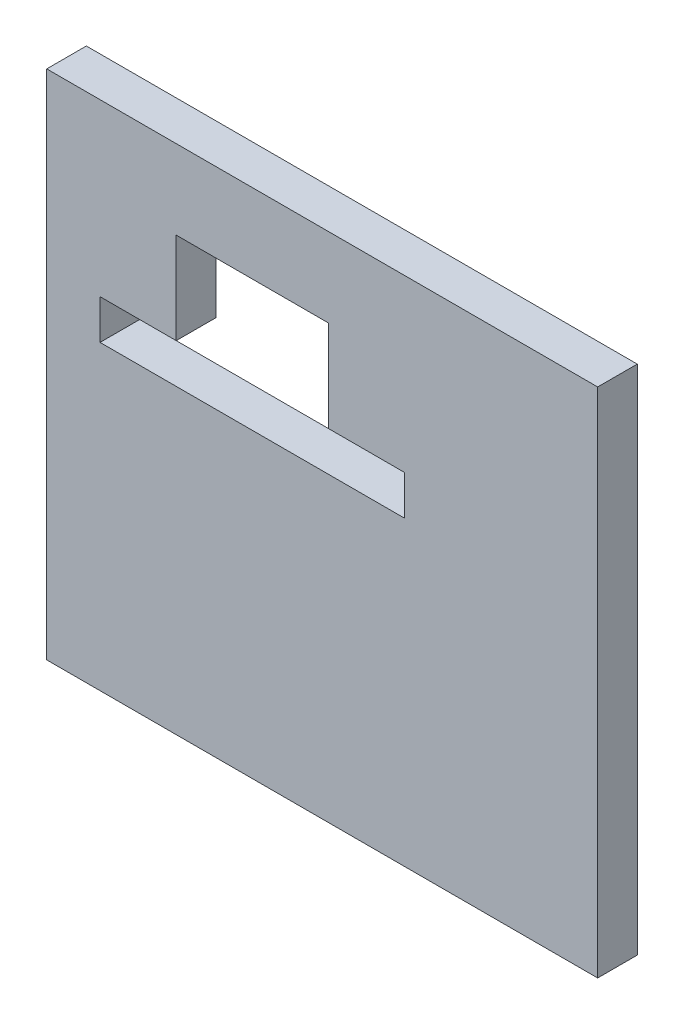
ISO-10303-21;
HEADER;
FILE_DESCRIPTION(('STEP AP214'),'2;1');
FILE_NAME('part.step','',(''),(''),'','','');
FILE_SCHEMA(('AUTOMOTIVE_DESIGN { 1 0 10303 214 1 1 1 1 }'));
ENDSEC;
DATA;
#1=APPLICATION_CONTEXT('core data for automotive mechanical design processes');
#2=APPLICATION_PROTOCOL_DEFINITION('international standard','automotive_design',2000,#1);
#3=PRODUCT_CONTEXT('',#1,'mechanical');
#4=PRODUCT('Part','Part','',(#3));
#5=PRODUCT_RELATED_PRODUCT_CATEGORY('part','',(#4));
#6=PRODUCT_DEFINITION_FORMATION('','',#4);
#7=PRODUCT_DEFINITION_CONTEXT('part definition',#1,'design');
#8=PRODUCT_DEFINITION('design','',#6,#7);
#9=PRODUCT_DEFINITION_SHAPE('','',#8);
#10=(LENGTH_UNIT() NAMED_UNIT(*) SI_UNIT(.MILLI.,.METRE.));
#11=(NAMED_UNIT(*) PLANE_ANGLE_UNIT() SI_UNIT($,.RADIAN.));
#12=(NAMED_UNIT(*) SI_UNIT($,.STERADIAN.) SOLID_ANGLE_UNIT());
#13=UNCERTAINTY_MEASURE_WITH_UNIT(LENGTH_MEASURE(1.E-05),#10,'distance_accuracy_value','');
#14=(GEOMETRIC_REPRESENTATION_CONTEXT(3) GLOBAL_UNCERTAINTY_ASSIGNED_CONTEXT((#13)) GLOBAL_UNIT_ASSIGNED_CONTEXT((#10,
#11,#12)) REPRESENTATION_CONTEXT('',''));
#15=CARTESIAN_POINT('',(0.,0.,0.));
#16=DIRECTION('',(0.,0.,1.));
#17=DIRECTION('',(1.,0.,0.));
#18=AXIS2_PLACEMENT_3D('',#15,#16,#17);
#19=CARTESIAN_POINT('',(37.,0.,5.2));
#20=DIRECTION('',(1.,0.,0.));
#21=DIRECTION('',(0.,0.,-1.));
#22=AXIS2_PLACEMENT_3D('',#19,#20,#21);
#23=PLANE('',#22);
#24=DIRECTION('',(0.,-1.,0.));
#25=VECTOR('',#24,1.);
#26=CARTESIAN_POINT('',(37.,0.,0.));
#27=LINE('',#26,#25);
#28=CARTESIAN_POINT('',(37.,56.8,0.));
#29=VERTEX_POINT('',#28);
#30=CARTESIAN_POINT('',(37.,44.8,0.));
#31=VERTEX_POINT('',#30);
#32=EDGE_CURVE('E171',#29,#31,#27,.T.);
#33=ORIENTED_EDGE('',*,*,#32,.T.);
#34=DIRECTION('',(0.,0.,-1.));
#35=VECTOR('',#34,1.);
#36=CARTESIAN_POINT('',(37.,44.8,5.2));
#37=LINE('',#36,#35);
#38=CARTESIAN_POINT('',(37.,44.8,5.2));
#39=VERTEX_POINT('',#38);
#40=EDGE_CURVE('E11',#39,#31,#37,.T.);
#41=ORIENTED_EDGE('',*,*,#40,.F.);
#42=DIRECTION('',(0.,-1.,0.));
#43=VECTOR('',#42,1.);
#44=CARTESIAN_POINT('',(37.,0.,5.2));
#45=LINE('',#44,#43);
#46=CARTESIAN_POINT('',(37.,56.8,5.2));
#47=VERTEX_POINT('',#46);
#48=EDGE_CURVE('E270',#47,#39,#45,.T.);
#49=ORIENTED_EDGE('',*,*,#48,.F.);
#50=DIRECTION('',(0.,0.,-1.));
#51=VECTOR('',#50,1.);
#52=CARTESIAN_POINT('',(37.,56.8,5.2));
#53=LINE('',#52,#51);
#54=EDGE_CURVE('E190',#47,#29,#53,.T.);
#55=ORIENTED_EDGE('',*,*,#54,.T.);
#56=EDGE_LOOP('',(#33,#41,#49,#55));
#57=FACE_BOUND('',#56,.T.);
#58=ADVANCED_FACE('F35',(#57),#23,.F.);
#59=CARTESIAN_POINT('',(0.,44.8,5.2));
#60=DIRECTION('',(0.,1.,0.));
#61=DIRECTION('',(-1.,0.,0.));
#62=AXIS2_PLACEMENT_3D('',#59,#60,#61);
#63=PLANE('',#62);
#64=DIRECTION('',(1.,0.,0.));
#65=VECTOR('',#64,1.);
#66=CARTESIAN_POINT('',(0.,44.8,0.));
#67=LINE('',#66,#65);
#68=CARTESIAN_POINT('',(47.,44.8,0.));
#69=VERTEX_POINT('',#68);
#70=EDGE_CURVE('E174',#31,#69,#67,.T.);
#71=ORIENTED_EDGE('',*,*,#70,.T.);
#72=DIRECTION('',(0.,0.,-1.));
#73=VECTOR('',#72,1.);
#74=CARTESIAN_POINT('',(47.,44.8,5.2));
#75=LINE('',#74,#73);
#76=CARTESIAN_POINT('',(47.,44.8,5.2));
#77=VERTEX_POINT('',#76);
#78=EDGE_CURVE('E45',#77,#69,#75,.T.);
#79=ORIENTED_EDGE('',*,*,#78,.F.);
#80=DIRECTION('',(1.,0.,0.));
#81=VECTOR('',#80,1.);
#82=CARTESIAN_POINT('',(0.,44.8,5.2));
#83=LINE('',#82,#81);
#84=EDGE_CURVE('E272',#39,#77,#83,.T.);
#85=ORIENTED_EDGE('',*,*,#84,.F.);
#86=ORIENTED_EDGE('',*,*,#40,.T.);
#87=EDGE_LOOP('',(#71,#79,#85,#86));
#88=FACE_BOUND('',#87,.T.);
#89=ADVANCED_FACE('F231',(#88),#63,.F.);
#90=CARTESIAN_POINT('',(47.,0.,5.2));
#91=DIRECTION('',(-1.,0.,0.));
#92=DIRECTION('',(0.,0.,1.));
#93=AXIS2_PLACEMENT_3D('',#90,#91,#92);
#94=PLANE('',#93);
#95=DIRECTION('',(0.,1.,0.));
#96=VECTOR('',#95,1.);
#97=CARTESIAN_POINT('',(47.,0.,0.));
#98=LINE('',#97,#96);
#99=CARTESIAN_POINT('',(47.,39.6,0.));
#100=VERTEX_POINT('',#99);
#101=EDGE_CURVE('E177',#100,#69,#98,.T.);
#102=ORIENTED_EDGE('',*,*,#101,.F.);
#103=DIRECTION('',(0.,0.,-1.));
#104=VECTOR('',#103,1.);
#105=CARTESIAN_POINT('',(47.,39.6,5.2));
#106=LINE('',#105,#104);
#107=CARTESIAN_POINT('',(47.,39.6,5.2));
#108=VERTEX_POINT('',#107);
#109=EDGE_CURVE('E196',#108,#100,#106,.T.);
#110=ORIENTED_EDGE('',*,*,#109,.F.);
#111=DIRECTION('',(0.,1.,0.));
#112=VECTOR('',#111,1.);
#113=CARTESIAN_POINT('',(47.,0.,5.2));
#114=LINE('',#113,#112);
#115=EDGE_CURVE('E274',#108,#77,#114,.T.);
#116=ORIENTED_EDGE('',*,*,#115,.T.);
#117=ORIENTED_EDGE('',*,*,#78,.T.);
#118=EDGE_LOOP('',(#102,#110,#116,#117));
#119=FACE_BOUND('',#118,.T.);
#120=ADVANCED_FACE('F237',(#119),#94,.T.);
#121=CARTESIAN_POINT('',(0.,39.6,5.2));
#122=DIRECTION('',(0.,1.,0.));
#123=DIRECTION('',(0.,0.,1.));
#124=AXIS2_PLACEMENT_3D('',#121,#122,#123);
#125=PLANE('',#124);
#126=DIRECTION('',(1.,0.,0.));
#127=VECTOR('',#126,1.);
#128=CARTESIAN_POINT('',(0.,39.6,0.));
#129=LINE('',#128,#127);
#130=CARTESIAN_POINT('',(7.,39.6,0.));
#131=VERTEX_POINT('',#130);
#132=EDGE_CURVE('E180',#131,#100,#129,.T.);
#133=ORIENTED_EDGE('',*,*,#132,.F.);
#134=DIRECTION('',(0.,0.,-1.));
#135=VECTOR('',#134,1.);
#136=CARTESIAN_POINT('',(7.,39.6,5.2));
#137=LINE('',#136,#135);
#138=CARTESIAN_POINT('',(7.,39.6,5.2));
#139=VERTEX_POINT('',#138);
#140=EDGE_CURVE('E194',#139,#131,#137,.T.);
#141=ORIENTED_EDGE('',*,*,#140,.F.);
#142=DIRECTION('',(1.,0.,0.));
#143=VECTOR('',#142,1.);
#144=CARTESIAN_POINT('',(0.,39.6,5.2));
#145=LINE('',#144,#143);
#146=EDGE_CURVE('E277',#139,#108,#145,.T.);
#147=ORIENTED_EDGE('',*,*,#146,.T.);
#148=ORIENTED_EDGE('',*,*,#109,.T.);
#149=EDGE_LOOP('',(#133,#141,#147,#148));
#150=FACE_BOUND('',#149,.T.);
#151=ADVANCED_FACE('F243',(#150),#125,.T.);
#152=CARTESIAN_POINT('',(7.,0.,5.2));
#153=DIRECTION('',(1.,0.,0.));
#154=DIRECTION('',(0.,0.,-1.));
#155=AXIS2_PLACEMENT_3D('',#152,#153,#154);
#156=PLANE('',#155);
#157=DIRECTION('',(0.,-1.,0.));
#158=VECTOR('',#157,1.);
#159=CARTESIAN_POINT('',(7.,0.,0.));
#160=LINE('',#159,#158);
#161=CARTESIAN_POINT('',(7.,44.8,0.));
#162=VERTEX_POINT('',#161);
#163=EDGE_CURVE('E183',#162,#131,#160,.T.);
#164=ORIENTED_EDGE('',*,*,#163,.F.);
#165=DIRECTION('',(0.,0.,-1.));
#166=VECTOR('',#165,1.);
#167=CARTESIAN_POINT('',(7.,44.8,5.2));
#168=LINE('',#167,#166);
#169=CARTESIAN_POINT('',(7.,44.8,5.2));
#170=VERTEX_POINT('',#169);
#171=EDGE_CURVE('E151',#170,#162,#168,.T.);
#172=ORIENTED_EDGE('',*,*,#171,.F.);
#173=DIRECTION('',(0.,-1.,0.));
#174=VECTOR('',#173,1.);
#175=CARTESIAN_POINT('',(7.,0.,5.2));
#176=LINE('',#175,#174);
#177=EDGE_CURVE('E144',#170,#139,#176,.T.);
#178=ORIENTED_EDGE('',*,*,#177,.T.);
#179=ORIENTED_EDGE('',*,*,#140,.T.);
#180=EDGE_LOOP('',(#164,#172,#178,#179));
#181=FACE_BOUND('',#180,.T.);
#182=ADVANCED_FACE('F247',(#181),#156,.T.);
#183=CARTESIAN_POINT('',(0.,44.8,5.2));
#184=DIRECTION('',(0.,1.,0.));
#185=DIRECTION('',(-1.,0.,0.));
#186=AXIS2_PLACEMENT_3D('',#183,#184,#185);
#187=PLANE('',#186);
#188=DIRECTION('',(1.,0.,0.));
#189=VECTOR('',#188,1.);
#190=CARTESIAN_POINT('',(0.,44.8,0.));
#191=LINE('',#190,#189);
#192=CARTESIAN_POINT('',(17.,44.8,0.));
#193=VERTEX_POINT('',#192);
#194=EDGE_CURVE('E150',#162,#193,#191,.T.);
#195=ORIENTED_EDGE('',*,*,#194,.T.);
#196=DIRECTION('',(0.,0.,-1.));
#197=VECTOR('',#196,1.);
#198=CARTESIAN_POINT('',(17.,44.8,5.2));
#199=LINE('',#198,#197);
#200=CARTESIAN_POINT('',(17.,44.8,5.2));
#201=VERTEX_POINT('',#200);
#202=EDGE_CURVE('E147',#201,#193,#199,.T.);
#203=ORIENTED_EDGE('',*,*,#202,.F.);
#204=DIRECTION('',(1.,0.,0.));
#205=VECTOR('',#204,1.);
#206=CARTESIAN_POINT('',(0.,44.8,5.2));
#207=LINE('',#206,#205);
#208=EDGE_CURVE('E137',#170,#201,#207,.T.);
#209=ORIENTED_EDGE('',*,*,#208,.F.);
#210=ORIENTED_EDGE('',*,*,#171,.T.);
#211=EDGE_LOOP('',(#195,#203,#209,#210));
#212=FACE_BOUND('',#211,.T.);
#213=ADVANCED_FACE('F148',(#212),#187,.F.);
#214=CARTESIAN_POINT('',(17.,0.,5.2));
#215=DIRECTION('',(-1.,0.,0.));
#216=DIRECTION('',(0.,0.,1.));
#217=AXIS2_PLACEMENT_3D('',#214,#215,#216);
#218=PLANE('',#217);
#219=DIRECTION('',(0.,1.,0.));
#220=VECTOR('',#219,1.);
#221=CARTESIAN_POINT('',(17.,0.,0.));
#222=LINE('',#221,#220);
#223=CARTESIAN_POINT('',(17.,56.8,0.));
#224=VERTEX_POINT('',#223);
#225=EDGE_CURVE('E95',#193,#224,#222,.T.);
#226=ORIENTED_EDGE('',*,*,#225,.T.);
#227=DIRECTION('',(0.,0.,-1.));
#228=VECTOR('',#227,1.);
#229=CARTESIAN_POINT('',(17.,56.8,5.2));
#230=LINE('',#229,#228);
#231=CARTESIAN_POINT('',(17.,56.8,5.2));
#232=VERTEX_POINT('',#231);
#233=EDGE_CURVE('E152',#232,#224,#230,.T.);
#234=ORIENTED_EDGE('',*,*,#233,.F.);
#235=DIRECTION('',(0.,1.,0.));
#236=VECTOR('',#235,1.);
#237=CARTESIAN_POINT('',(17.,0.,5.2));
#238=LINE('',#237,#236);
#239=EDGE_CURVE('E141',#201,#232,#238,.T.);
#240=ORIENTED_EDGE('',*,*,#239,.F.);
#241=ORIENTED_EDGE('',*,*,#202,.T.);
#242=EDGE_LOOP('',(#226,#234,#240,#241));
#243=FACE_BOUND('',#242,.T.);
#244=ADVANCED_FACE('F154',(#243),#218,.F.);
#245=CARTESIAN_POINT('',(0.,0.,5.2));
#246=DIRECTION('',(1.,0.,0.));
#247=DIRECTION('',(0.,1.,0.));
#248=AXIS2_PLACEMENT_3D('',#245,#246,#247);
#249=PLANE('',#248);
#250=DIRECTION('',(0.,-1.,0.));
#251=VECTOR('',#250,1.);
#252=CARTESIAN_POINT('',(0.,0.,0.));
#253=LINE('',#252,#251);
#254=CARTESIAN_POINT('',(0.,67.2,0.));
#255=VERTEX_POINT('',#254);
#256=CARTESIAN_POINT('',(0.,0.,0.));
#257=VERTEX_POINT('',#256);
#258=EDGE_CURVE('E160',#255,#257,#253,.T.);
#259=ORIENTED_EDGE('',*,*,#258,.T.);
#260=DIRECTION('',(0.,0.,-1.));
#261=VECTOR('',#260,1.);
#262=CARTESIAN_POINT('',(0.,0.,5.2));
#263=LINE('',#262,#261);
#264=CARTESIAN_POINT('',(0.,0.,5.2));
#265=VERTEX_POINT('',#264);
#266=EDGE_CURVE('E39',#265,#257,#263,.T.);
#267=ORIENTED_EDGE('',*,*,#266,.F.);
#268=DIRECTION('',(0.,-1.,0.));
#269=VECTOR('',#268,1.);
#270=CARTESIAN_POINT('',(0.,0.,5.2));
#271=LINE('',#270,#269);
#272=CARTESIAN_POINT('',(0.,67.2,5.2));
#273=VERTEX_POINT('',#272);
#274=EDGE_CURVE('E189',#273,#265,#271,.T.);
#275=ORIENTED_EDGE('',*,*,#274,.F.);
#276=DIRECTION('',(0.,0.,-1.));
#277=VECTOR('',#276,1.);
#278=CARTESIAN_POINT('',(0.,67.2,5.2));
#279=LINE('',#278,#277);
#280=EDGE_CURVE('E156',#273,#255,#279,.T.);
#281=ORIENTED_EDGE('',*,*,#280,.T.);
#282=EDGE_LOOP('',(#259,#267,#275,#281));
#283=FACE_BOUND('',#282,.T.);
#284=ADVANCED_FACE('F37',(#283),#249,.F.);
#285=CARTESIAN_POINT('',(0.,0.,5.2));
#286=DIRECTION('',(0.,1.,0.));
#287=DIRECTION('',(0.,0.,1.));
#288=AXIS2_PLACEMENT_3D('',#285,#286,#287);
#289=PLANE('',#288);
#290=DIRECTION('',(1.,0.,0.));
#291=VECTOR('',#290,1.);
#292=CARTESIAN_POINT('',(0.,0.,0.));
#293=LINE('',#292,#291);
#294=CARTESIAN_POINT('',(72.33,0.,0.));
#295=VERTEX_POINT('',#294);
#296=EDGE_CURVE('E163',#257,#295,#293,.T.);
#297=ORIENTED_EDGE('',*,*,#296,.T.);
#298=DIRECTION('',(0.,0.,-1.));
#299=VECTOR('',#298,1.);
#300=CARTESIAN_POINT('',(72.33,0.,5.2));
#301=LINE('',#300,#299);
#302=CARTESIAN_POINT('',(72.33,0.,5.2));
#303=VERTEX_POINT('',#302);
#304=EDGE_CURVE('E201',#303,#295,#301,.T.);
#305=ORIENTED_EDGE('',*,*,#304,.F.);
#306=DIRECTION('',(1.,0.,0.));
#307=VECTOR('',#306,1.);
#308=CARTESIAN_POINT('',(0.,0.,5.2));
#309=LINE('',#308,#307);
#310=EDGE_CURVE('E110',#265,#303,#309,.T.);
#311=ORIENTED_EDGE('',*,*,#310,.F.);
#312=ORIENTED_EDGE('',*,*,#266,.T.);
#313=EDGE_LOOP('',(#297,#305,#311,#312));
#314=FACE_BOUND('',#313,.T.);
#315=ADVANCED_FACE('F207',(#314),#289,.F.);
#316=CARTESIAN_POINT('',(72.33,0.,5.2));
#317=DIRECTION('',(-1.,0.,0.));
#318=DIRECTION('',(0.,0.,1.));
#319=AXIS2_PLACEMENT_3D('',#316,#317,#318);
#320=PLANE('',#319);
#321=DIRECTION('',(0.,1.,0.));
#322=VECTOR('',#321,1.);
#323=CARTESIAN_POINT('',(72.33,0.,0.));
#324=LINE('',#323,#322);
#325=CARTESIAN_POINT('',(72.33,67.2,0.));
#326=VERTEX_POINT('',#325);
#327=EDGE_CURVE('E165',#295,#326,#324,.T.);
#328=ORIENTED_EDGE('',*,*,#327,.T.);
#329=DIRECTION('',(0.,0.,-1.));
#330=VECTOR('',#329,1.);
#331=CARTESIAN_POINT('',(72.33,67.2,5.2));
#332=LINE('',#331,#330);
#333=CARTESIAN_POINT('',(72.33,67.2,5.2));
#334=VERTEX_POINT('',#333);
#335=EDGE_CURVE('E200',#334,#326,#332,.T.);
#336=ORIENTED_EDGE('',*,*,#335,.F.);
#337=DIRECTION('',(0.,1.,0.));
#338=VECTOR('',#337,1.);
#339=CARTESIAN_POINT('',(72.33,0.,5.2));
#340=LINE('',#339,#338);
#341=EDGE_CURVE('E265',#303,#334,#340,.T.);
#342=ORIENTED_EDGE('',*,*,#341,.F.);
#343=ORIENTED_EDGE('',*,*,#304,.T.);
#344=EDGE_LOOP('',(#328,#336,#342,#343));
#345=FACE_BOUND('',#344,.T.);
#346=ADVANCED_FACE('F221',(#345),#320,.F.);
#347=CARTESIAN_POINT('',(0.,67.2,5.2));
#348=DIRECTION('',(0.,1.,0.));
#349=DIRECTION('',(0.,0.,1.));
#350=AXIS2_PLACEMENT_3D('',#347,#348,#349);
#351=PLANE('',#350);
#352=DIRECTION('',(1.,0.,0.));
#353=VECTOR('',#352,1.);
#354=CARTESIAN_POINT('',(0.,67.2,0.));
#355=LINE('',#354,#353);
#356=EDGE_CURVE('E168',#255,#326,#355,.T.);
#357=ORIENTED_EDGE('',*,*,#356,.F.);
#358=ORIENTED_EDGE('',*,*,#280,.F.);
#359=DIRECTION('',(1.,0.,0.));
#360=VECTOR('',#359,1.);
#361=CARTESIAN_POINT('',(0.,67.2,5.2));
#362=LINE('',#361,#360);
#363=EDGE_CURVE('E220',#273,#334,#362,.T.);
#364=ORIENTED_EDGE('',*,*,#363,.T.);
#365=ORIENTED_EDGE('',*,*,#335,.T.);
#366=EDGE_LOOP('',(#357,#358,#364,#365));
#367=FACE_BOUND('',#366,.T.);
#368=ADVANCED_FACE('F216',(#367),#351,.T.);
#369=CARTESIAN_POINT('',(0.,56.8,5.2));
#370=DIRECTION('',(0.,1.,0.));
#371=DIRECTION('',(0.,0.,1.));
#372=AXIS2_PLACEMENT_3D('',#369,#370,#371);
#373=PLANE('',#372);
#374=DIRECTION('',(1.,0.,0.));
#375=VECTOR('',#374,1.);
#376=CARTESIAN_POINT('',(0.,56.8,0.));
#377=LINE('',#376,#375);
#378=EDGE_CURVE('E101',#224,#29,#377,.T.);
#379=ORIENTED_EDGE('',*,*,#378,.T.);
#380=ORIENTED_EDGE('',*,*,#54,.F.);
#381=DIRECTION('',(1.,0.,0.));
#382=VECTOR('',#381,1.);
#383=CARTESIAN_POINT('',(0.,56.8,5.2));
#384=LINE('',#383,#382);
#385=EDGE_CURVE('E54',#232,#47,#384,.T.);
#386=ORIENTED_EDGE('',*,*,#385,.F.);
#387=ORIENTED_EDGE('',*,*,#233,.T.);
#388=EDGE_LOOP('',(#379,#380,#386,#387));
#389=FACE_BOUND('',#388,.T.);
#390=ADVANCED_FACE('F228',(#389),#373,.F.);
#391=CARTESIAN_POINT('',(0.,0.,5.2));
#392=DIRECTION('',(0.,0.,1.));
#393=DIRECTION('',(1.,0.,0.));
#394=AXIS2_PLACEMENT_3D('',#391,#392,#393);
#395=PLANE('',#394);
#396=ORIENTED_EDGE('',*,*,#274,.T.);
#397=ORIENTED_EDGE('',*,*,#310,.T.);
#398=ORIENTED_EDGE('',*,*,#341,.T.);
#399=ORIENTED_EDGE('',*,*,#363,.F.);
#400=EDGE_LOOP('',(#396,#397,#398,#399));
#401=FACE_BOUND('',#400,.T.);
#402=ORIENTED_EDGE('',*,*,#48,.T.);
#403=ORIENTED_EDGE('',*,*,#84,.T.);
#404=ORIENTED_EDGE('',*,*,#115,.F.);
#405=ORIENTED_EDGE('',*,*,#146,.F.);
#406=ORIENTED_EDGE('',*,*,#177,.F.);
#407=ORIENTED_EDGE('',*,*,#208,.T.);
#408=ORIENTED_EDGE('',*,*,#239,.T.);
#409=ORIENTED_EDGE('',*,*,#385,.T.);
#410=EDGE_LOOP('',(#402,#403,#404,#405,#406,#407,#408,#409));
#411=FACE_BOUND('',#410,.T.);
#412=ADVANCED_FACE('F139',(#401,#411),#395,.T.);
#413=CARTESIAN_POINT('',(0.,0.,0.));
#414=DIRECTION('',(0.,0.,1.));
#415=DIRECTION('',(1.,0.,0.));
#416=AXIS2_PLACEMENT_3D('',#413,#414,#415);
#417=PLANE('',#416);
#418=ORIENTED_EDGE('',*,*,#258,.F.);
#419=ORIENTED_EDGE('',*,*,#356,.T.);
#420=ORIENTED_EDGE('',*,*,#327,.F.);
#421=ORIENTED_EDGE('',*,*,#296,.F.);
#422=EDGE_LOOP('',(#418,#419,#420,#421));
#423=FACE_BOUND('',#422,.T.);
#424=ORIENTED_EDGE('',*,*,#32,.F.);
#425=ORIENTED_EDGE('',*,*,#378,.F.);
#426=ORIENTED_EDGE('',*,*,#225,.F.);
#427=ORIENTED_EDGE('',*,*,#194,.F.);
#428=ORIENTED_EDGE('',*,*,#163,.T.);
#429=ORIENTED_EDGE('',*,*,#132,.T.);
#430=ORIENTED_EDGE('',*,*,#101,.T.);
#431=ORIENTED_EDGE('',*,*,#70,.F.);
#432=EDGE_LOOP('',(#424,#425,#426,#427,#428,#429,#430,#431));
#433=FACE_BOUND('',#432,.T.);
#434=ADVANCED_FACE('F213',(#423,#433),#417,.F.);
#435=CLOSED_SHELL('',(#58,#89,#120,#151,#182,#213,#244,#284,#315,#346,#368,#390,#412,#434));
#436=MANIFOLD_SOLID_BREP('B2',#435);
#437=ADVANCED_BREP_SHAPE_REPRESENTATION('',(#18,#436),#14);
#438=SHAPE_DEFINITION_REPRESENTATION(#9,#437);
ENDSEC;
END-ISO-10303-21;
